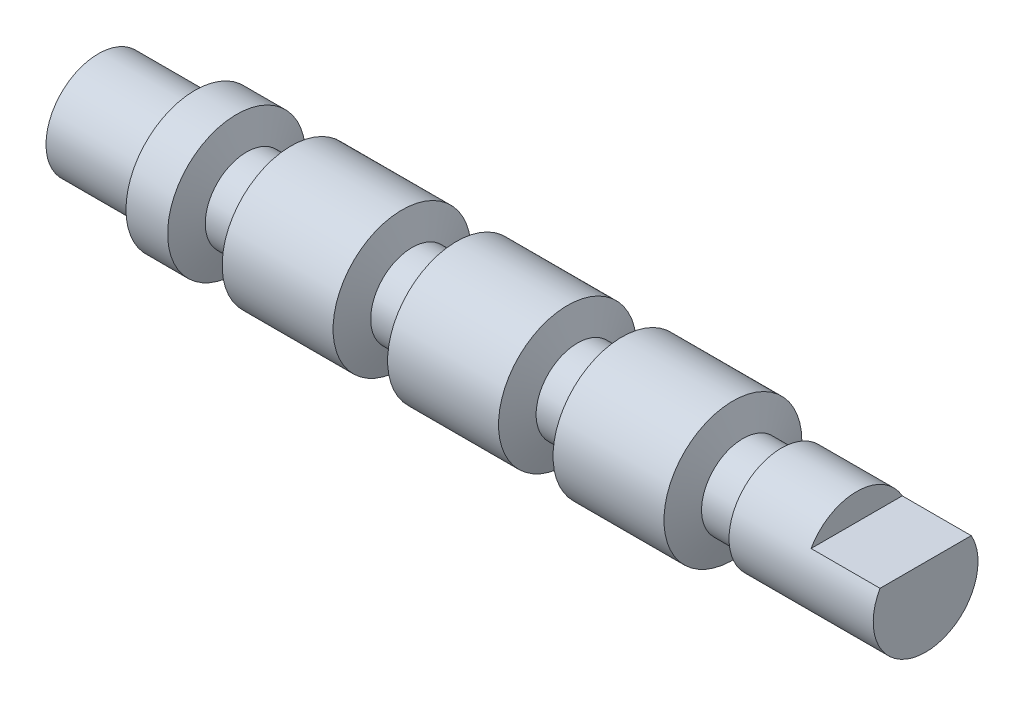
ISO-10303-21;
HEADER;
FILE_DESCRIPTION(('STEP AP214'),'2;1');
FILE_NAME('part.step','',(''),(''),'','','');
FILE_SCHEMA(('AUTOMOTIVE_DESIGN { 1 0 10303 214 1 1 1 1 }'));
ENDSEC;
DATA;
#1=APPLICATION_CONTEXT('core data for automotive mechanical design processes');
#2=APPLICATION_PROTOCOL_DEFINITION('international standard','automotive_design',2000,#1);
#3=PRODUCT_CONTEXT('',#1,'mechanical');
#4=PRODUCT('Part','Part','',(#3));
#5=PRODUCT_RELATED_PRODUCT_CATEGORY('part','',(#4));
#6=PRODUCT_DEFINITION_FORMATION('','',#4);
#7=PRODUCT_DEFINITION_CONTEXT('part definition',#1,'design');
#8=PRODUCT_DEFINITION('design','',#6,#7);
#9=PRODUCT_DEFINITION_SHAPE('','',#8);
#10=(LENGTH_UNIT() NAMED_UNIT(*) SI_UNIT(.MILLI.,.METRE.));
#11=(NAMED_UNIT(*) PLANE_ANGLE_UNIT() SI_UNIT($,.RADIAN.));
#12=(NAMED_UNIT(*) SI_UNIT($,.STERADIAN.) SOLID_ANGLE_UNIT());
#13=UNCERTAINTY_MEASURE_WITH_UNIT(LENGTH_MEASURE(1.E-05),#10,'distance_accuracy_value','');
#14=(GEOMETRIC_REPRESENTATION_CONTEXT(3) GLOBAL_UNCERTAINTY_ASSIGNED_CONTEXT((#13)) GLOBAL_UNIT_ASSIGNED_CONTEXT((#10,
#11,#12)) REPRESENTATION_CONTEXT('',''));
#15=CARTESIAN_POINT('',(0.,0.,0.));
#16=DIRECTION('',(0.,0.,1.));
#17=DIRECTION('',(1.,0.,0.));
#18=AXIS2_PLACEMENT_3D('',#15,#16,#17);
#19=CARTESIAN_POINT('',(19.9779404685324,0.,5.));
#20=DIRECTION('',(1.,0.,0.));
#21=DIRECTION('',(0.,0.,-1.));
#22=AXIS2_PLACEMENT_3D('',#19,#20,#21);
#23=CONICAL_SURFACE('',#22,5.,1.22173047639603);
#24=CARTESIAN_POINT('',(19.25,0.,5.));
#25=DIRECTION('',(1.,0.,0.));
#26=DIRECTION('',(0.,0.,-1.));
#27=AXIS2_PLACEMENT_3D('',#24,#25,#26);
#28=CIRCLE('',#27,3.);
#29=CARTESIAN_POINT('',(19.25,0.,2.));
#30=VERTEX_POINT('',#29);
#31=EDGE_CURVE('E108',#30,#30,#28,.T.);
#32=ORIENTED_EDGE('',*,*,#31,.T.);
#33=EDGE_LOOP('',(#32));
#34=FACE_BOUND('',#33,.T.);
#35=CARTESIAN_POINT('',(19.541176187413,0.,5.));
#36=DIRECTION('',(1.,0.,0.));
#37=DIRECTION('',(0.,0.,-1.));
#38=AXIS2_PLACEMENT_3D('',#35,#36,#37);
#39=CIRCLE('',#38,3.8);
#40=CARTESIAN_POINT('',(19.541176187413,0.,1.2));
#41=VERTEX_POINT('',#40);
#42=EDGE_CURVE('E89',#41,#41,#39,.F.);
#43=ORIENTED_EDGE('',*,*,#42,.T.);
#44=EDGE_LOOP('',(#43));
#45=FACE_BOUND('',#44,.T.);
#46=ADVANCED_FACE('F45',(#34,#45),#23,.T.);
#47=CARTESIAN_POINT('',(30.,0.,5.));
#48=DIRECTION('',(1.,0.,0.));
#49=DIRECTION('',(0.,0.,-1.));
#50=AXIS2_PLACEMENT_3D('',#47,#48,#49);
#51=CYLINDRICAL_SURFACE('',#50,5.);
#52=CARTESIAN_POINT('',(-19.9779404685324,0.,5.));
#53=DIRECTION('',(1.,0.,0.));
#54=DIRECTION('',(0.,0.,-1.));
#55=AXIS2_PLACEMENT_3D('',#52,#53,#54);
#56=CIRCLE('',#55,5.);
#57=CARTESIAN_POINT('',(-19.9779404685324,0.,0.));
#58=VERTEX_POINT('',#57);
#59=EDGE_CURVE('E11',#58,#58,#56,.T.);
#60=ORIENTED_EDGE('',*,*,#59,.F.);
#61=EDGE_LOOP('',(#60));
#62=FACE_BOUND('',#61,.T.);
#63=CARTESIAN_POINT('',(-23.,0.,5.));
#64=DIRECTION('',(-1.,0.,0.));
#65=DIRECTION('',(0.,0.,1.));
#66=AXIS2_PLACEMENT_3D('',#63,#64,#65);
#67=CIRCLE('',#66,5.00000000000017);
#68=CARTESIAN_POINT('',(-23.,0.,10.0000000000002));
#69=VERTEX_POINT('',#68);
#70=EDGE_CURVE('E101',#69,#69,#67,.T.);
#71=ORIENTED_EDGE('',*,*,#70,.F.);
#72=EDGE_LOOP('',(#71));
#73=FACE_BOUND('',#72,.T.);
#74=ADVANCED_FACE('F168',(#62,#73),#51,.T.);
#75=CARTESIAN_POINT('',(-19.25,0.,5.));
#76=DIRECTION('',(-1.,0.,0.));
#77=DIRECTION('',(0.,0.,1.));
#78=AXIS2_PLACEMENT_3D('',#75,#76,#77);
#79=CONICAL_SURFACE('',#78,3.,1.22173047639603);
#80=ORIENTED_EDGE('',*,*,#59,.T.);
#81=EDGE_LOOP('',(#80));
#82=FACE_BOUND('',#81,.T.);
#83=CARTESIAN_POINT('',(-19.25,0.,5.));
#84=DIRECTION('',(1.,0.,0.));
#85=DIRECTION('',(0.,0.,-1.));
#86=AXIS2_PLACEMENT_3D('',#83,#84,#85);
#87=CIRCLE('',#86,3.);
#88=CARTESIAN_POINT('',(-19.25,0.,2.));
#89=VERTEX_POINT('',#88);
#90=EDGE_CURVE('E54',#89,#89,#87,.T.);
#91=ORIENTED_EDGE('',*,*,#90,.F.);
#92=EDGE_LOOP('',(#91));
#93=FACE_BOUND('',#92,.T.);
#94=ADVANCED_FACE('F166',(#82,#93),#79,.T.);
#95=CARTESIAN_POINT('',(30.,0.,5.));
#96=DIRECTION('',(1.,0.,0.));
#97=DIRECTION('',(0.,0.,-1.));
#98=AXIS2_PLACEMENT_3D('',#95,#96,#97);
#99=CYLINDRICAL_SURFACE('',#98,3.);
#100=ORIENTED_EDGE('',*,*,#90,.T.);
#101=EDGE_LOOP('',(#100));
#102=FACE_BOUND('',#101,.T.);
#103=CARTESIAN_POINT('',(-16.75,0.,5.));
#104=DIRECTION('',(1.,0.,0.));
#105=DIRECTION('',(0.,0.,-1.));
#106=AXIS2_PLACEMENT_3D('',#103,#104,#105);
#107=CIRCLE('',#106,3.);
#108=CARTESIAN_POINT('',(-16.75,0.,2.));
#109=VERTEX_POINT('',#108);
#110=EDGE_CURVE('E156',#109,#109,#107,.T.);
#111=ORIENTED_EDGE('',*,*,#110,.F.);
#112=EDGE_LOOP('',(#111));
#113=FACE_BOUND('',#112,.T.);
#114=ADVANCED_FACE('F163',(#102,#113),#99,.T.);
#115=CARTESIAN_POINT('',(-16.0220595314676,0.,5.));
#116=DIRECTION('',(1.,0.,0.));
#117=DIRECTION('',(0.,0.,-1.));
#118=AXIS2_PLACEMENT_3D('',#115,#116,#117);
#119=CONICAL_SURFACE('',#118,5.,1.22173047639603);
#120=ORIENTED_EDGE('',*,*,#110,.T.);
#121=EDGE_LOOP('',(#120));
#122=FACE_BOUND('',#121,.T.);
#123=CARTESIAN_POINT('',(-16.0220595314676,0.,5.));
#124=DIRECTION('',(1.,0.,0.));
#125=DIRECTION('',(0.,0.,-1.));
#126=AXIS2_PLACEMENT_3D('',#123,#124,#125);
#127=CIRCLE('',#126,5.);
#128=CARTESIAN_POINT('',(-16.0220595314676,0.,0.));
#129=VERTEX_POINT('',#128);
#130=EDGE_CURVE('E152',#129,#129,#127,.T.);
#131=ORIENTED_EDGE('',*,*,#130,.F.);
#132=EDGE_LOOP('',(#131));
#133=FACE_BOUND('',#132,.T.);
#134=ADVANCED_FACE('F174',(#122,#133),#119,.T.);
#135=CARTESIAN_POINT('',(30.,0.,5.));
#136=DIRECTION('',(1.,0.,0.));
#137=DIRECTION('',(0.,0.,-1.));
#138=AXIS2_PLACEMENT_3D('',#135,#136,#137);
#139=CYLINDRICAL_SURFACE('',#138,5.);
#140=ORIENTED_EDGE('',*,*,#130,.T.);
#141=EDGE_LOOP('',(#140));
#142=FACE_BOUND('',#141,.T.);
#143=CARTESIAN_POINT('',(-7.9779404685324,0.,5.));
#144=DIRECTION('',(1.,0.,0.));
#145=DIRECTION('',(0.,0.,-1.));
#146=AXIS2_PLACEMENT_3D('',#143,#144,#145);
#147=CIRCLE('',#146,5.);
#148=CARTESIAN_POINT('',(-7.9779404685324,0.,0.));
#149=VERTEX_POINT('',#148);
#150=EDGE_CURVE('E148',#149,#149,#147,.T.);
#151=ORIENTED_EDGE('',*,*,#150,.F.);
#152=EDGE_LOOP('',(#151));
#153=FACE_BOUND('',#152,.T.);
#154=ADVANCED_FACE('F229',(#142,#153),#139,.T.);
#155=CARTESIAN_POINT('',(-7.25,0.,5.));
#156=DIRECTION('',(-1.,0.,0.));
#157=DIRECTION('',(0.,0.,1.));
#158=AXIS2_PLACEMENT_3D('',#155,#156,#157);
#159=CONICAL_SURFACE('',#158,3.,1.22173047639603);
#160=ORIENTED_EDGE('',*,*,#150,.T.);
#161=EDGE_LOOP('',(#160));
#162=FACE_BOUND('',#161,.T.);
#163=CARTESIAN_POINT('',(-7.25,0.,5.));
#164=DIRECTION('',(1.,0.,0.));
#165=DIRECTION('',(0.,0.,-1.));
#166=AXIS2_PLACEMENT_3D('',#163,#164,#165);
#167=CIRCLE('',#166,3.);
#168=CARTESIAN_POINT('',(-7.25,0.,2.));
#169=VERTEX_POINT('',#168);
#170=EDGE_CURVE('E144',#169,#169,#167,.T.);
#171=ORIENTED_EDGE('',*,*,#170,.F.);
#172=EDGE_LOOP('',(#171));
#173=FACE_BOUND('',#172,.T.);
#174=ADVANCED_FACE('F225',(#162,#173),#159,.T.);
#175=CARTESIAN_POINT('',(30.,0.,5.));
#176=DIRECTION('',(1.,0.,0.));
#177=DIRECTION('',(0.,0.,-1.));
#178=AXIS2_PLACEMENT_3D('',#175,#176,#177);
#179=CYLINDRICAL_SURFACE('',#178,3.);
#180=ORIENTED_EDGE('',*,*,#170,.T.);
#181=EDGE_LOOP('',(#180));
#182=FACE_BOUND('',#181,.T.);
#183=CARTESIAN_POINT('',(-4.75,0.,5.));
#184=DIRECTION('',(1.,0.,0.));
#185=DIRECTION('',(0.,0.,-1.));
#186=AXIS2_PLACEMENT_3D('',#183,#184,#185);
#187=CIRCLE('',#186,3.);
#188=CARTESIAN_POINT('',(-4.75,0.,2.));
#189=VERTEX_POINT('',#188);
#190=EDGE_CURVE('E140',#189,#189,#187,.T.);
#191=ORIENTED_EDGE('',*,*,#190,.F.);
#192=EDGE_LOOP('',(#191));
#193=FACE_BOUND('',#192,.T.);
#194=ADVANCED_FACE('F221',(#182,#193),#179,.T.);
#195=CARTESIAN_POINT('',(-4.0220595314676,0.,5.));
#196=DIRECTION('',(1.,0.,0.));
#197=DIRECTION('',(0.,0.,-1.));
#198=AXIS2_PLACEMENT_3D('',#195,#196,#197);
#199=CONICAL_SURFACE('',#198,5.,1.22173047639603);
#200=ORIENTED_EDGE('',*,*,#190,.T.);
#201=EDGE_LOOP('',(#200));
#202=FACE_BOUND('',#201,.T.);
#203=CARTESIAN_POINT('',(-4.0220595314676,0.,5.));
#204=DIRECTION('',(1.,0.,0.));
#205=DIRECTION('',(0.,0.,-1.));
#206=AXIS2_PLACEMENT_3D('',#203,#204,#205);
#207=CIRCLE('',#206,5.);
#208=CARTESIAN_POINT('',(-4.0220595314676,0.,0.));
#209=VERTEX_POINT('',#208);
#210=EDGE_CURVE('E136',#209,#209,#207,.T.);
#211=ORIENTED_EDGE('',*,*,#210,.F.);
#212=EDGE_LOOP('',(#211));
#213=FACE_BOUND('',#212,.T.);
#214=ADVANCED_FACE('F217',(#202,#213),#199,.T.);
#215=CARTESIAN_POINT('',(30.,0.,5.));
#216=DIRECTION('',(1.,0.,0.));
#217=DIRECTION('',(0.,0.,-1.));
#218=AXIS2_PLACEMENT_3D('',#215,#216,#217);
#219=CYLINDRICAL_SURFACE('',#218,5.);
#220=ORIENTED_EDGE('',*,*,#210,.T.);
#221=EDGE_LOOP('',(#220));
#222=FACE_BOUND('',#221,.T.);
#223=CARTESIAN_POINT('',(4.0220595314676,0.,5.));
#224=DIRECTION('',(1.,0.,0.));
#225=DIRECTION('',(0.,0.,-1.));
#226=AXIS2_PLACEMENT_3D('',#223,#224,#225);
#227=CIRCLE('',#226,5.);
#228=CARTESIAN_POINT('',(4.0220595314676,0.,0.));
#229=VERTEX_POINT('',#228);
#230=EDGE_CURVE('E132',#229,#229,#227,.T.);
#231=ORIENTED_EDGE('',*,*,#230,.F.);
#232=EDGE_LOOP('',(#231));
#233=FACE_BOUND('',#232,.T.);
#234=ADVANCED_FACE('F213',(#222,#233),#219,.T.);
#235=CARTESIAN_POINT('',(4.75,0.,5.));
#236=DIRECTION('',(-1.,0.,0.));
#237=DIRECTION('',(0.,0.,1.));
#238=AXIS2_PLACEMENT_3D('',#235,#236,#237);
#239=CONICAL_SURFACE('',#238,3.,1.22173047639603);
#240=ORIENTED_EDGE('',*,*,#230,.T.);
#241=EDGE_LOOP('',(#240));
#242=FACE_BOUND('',#241,.T.);
#243=CARTESIAN_POINT('',(4.75,0.,5.));
#244=DIRECTION('',(1.,0.,0.));
#245=DIRECTION('',(0.,0.,-1.));
#246=AXIS2_PLACEMENT_3D('',#243,#244,#245);
#247=CIRCLE('',#246,3.);
#248=CARTESIAN_POINT('',(4.75,0.,2.));
#249=VERTEX_POINT('',#248);
#250=EDGE_CURVE('E128',#249,#249,#247,.T.);
#251=ORIENTED_EDGE('',*,*,#250,.F.);
#252=EDGE_LOOP('',(#251));
#253=FACE_BOUND('',#252,.T.);
#254=ADVANCED_FACE('F209',(#242,#253),#239,.T.);
#255=CARTESIAN_POINT('',(30.,0.,5.));
#256=DIRECTION('',(1.,0.,0.));
#257=DIRECTION('',(0.,0.,-1.));
#258=AXIS2_PLACEMENT_3D('',#255,#256,#257);
#259=CYLINDRICAL_SURFACE('',#258,3.);
#260=ORIENTED_EDGE('',*,*,#250,.T.);
#261=EDGE_LOOP('',(#260));
#262=FACE_BOUND('',#261,.T.);
#263=CARTESIAN_POINT('',(7.25,0.,5.));
#264=DIRECTION('',(1.,0.,0.));
#265=DIRECTION('',(0.,0.,-1.));
#266=AXIS2_PLACEMENT_3D('',#263,#264,#265);
#267=CIRCLE('',#266,3.);
#268=CARTESIAN_POINT('',(7.25,0.,2.));
#269=VERTEX_POINT('',#268);
#270=EDGE_CURVE('E124',#269,#269,#267,.T.);
#271=ORIENTED_EDGE('',*,*,#270,.F.);
#272=EDGE_LOOP('',(#271));
#273=FACE_BOUND('',#272,.T.);
#274=ADVANCED_FACE('F205',(#262,#273),#259,.T.);
#275=CARTESIAN_POINT('',(7.9779404685324,0.,5.));
#276=DIRECTION('',(1.,0.,0.));
#277=DIRECTION('',(0.,0.,-1.));
#278=AXIS2_PLACEMENT_3D('',#275,#276,#277);
#279=CONICAL_SURFACE('',#278,5.,1.22173047639603);
#280=ORIENTED_EDGE('',*,*,#270,.T.);
#281=EDGE_LOOP('',(#280));
#282=FACE_BOUND('',#281,.T.);
#283=CARTESIAN_POINT('',(7.9779404685324,0.,5.));
#284=DIRECTION('',(1.,0.,0.));
#285=DIRECTION('',(0.,0.,-1.));
#286=AXIS2_PLACEMENT_3D('',#283,#284,#285);
#287=CIRCLE('',#286,5.);
#288=CARTESIAN_POINT('',(7.9779404685324,0.,0.));
#289=VERTEX_POINT('',#288);
#290=EDGE_CURVE('E120',#289,#289,#287,.T.);
#291=ORIENTED_EDGE('',*,*,#290,.F.);
#292=EDGE_LOOP('',(#291));
#293=FACE_BOUND('',#292,.T.);
#294=ADVANCED_FACE('F201',(#282,#293),#279,.T.);
#295=CARTESIAN_POINT('',(30.,0.,5.));
#296=DIRECTION('',(1.,0.,0.));
#297=DIRECTION('',(0.,0.,-1.));
#298=AXIS2_PLACEMENT_3D('',#295,#296,#297);
#299=CYLINDRICAL_SURFACE('',#298,5.);
#300=ORIENTED_EDGE('',*,*,#290,.T.);
#301=EDGE_LOOP('',(#300));
#302=FACE_BOUND('',#301,.T.);
#303=CARTESIAN_POINT('',(16.0220595314676,0.,5.));
#304=DIRECTION('',(1.,0.,0.));
#305=DIRECTION('',(0.,0.,-1.));
#306=AXIS2_PLACEMENT_3D('',#303,#304,#305);
#307=CIRCLE('',#306,5.);
#308=CARTESIAN_POINT('',(16.0220595314676,0.,0.));
#309=VERTEX_POINT('',#308);
#310=EDGE_CURVE('E116',#309,#309,#307,.T.);
#311=ORIENTED_EDGE('',*,*,#310,.F.);
#312=EDGE_LOOP('',(#311));
#313=FACE_BOUND('',#312,.T.);
#314=ADVANCED_FACE('F197',(#302,#313),#299,.T.);
#315=CARTESIAN_POINT('',(16.75,0.,5.));
#316=DIRECTION('',(-1.,0.,0.));
#317=DIRECTION('',(0.,0.,1.));
#318=AXIS2_PLACEMENT_3D('',#315,#316,#317);
#319=CONICAL_SURFACE('',#318,3.,1.22173047639603);
#320=ORIENTED_EDGE('',*,*,#310,.T.);
#321=EDGE_LOOP('',(#320));
#322=FACE_BOUND('',#321,.T.);
#323=CARTESIAN_POINT('',(16.75,0.,5.));
#324=DIRECTION('',(1.,0.,0.));
#325=DIRECTION('',(0.,0.,-1.));
#326=AXIS2_PLACEMENT_3D('',#323,#324,#325);
#327=CIRCLE('',#326,3.);
#328=CARTESIAN_POINT('',(16.75,0.,2.));
#329=VERTEX_POINT('',#328);
#330=EDGE_CURVE('E112',#329,#329,#327,.T.);
#331=ORIENTED_EDGE('',*,*,#330,.F.);
#332=EDGE_LOOP('',(#331));
#333=FACE_BOUND('',#332,.T.);
#334=ADVANCED_FACE('F193',(#322,#333),#319,.T.);
#335=CARTESIAN_POINT('',(30.,0.,5.));
#336=DIRECTION('',(1.,0.,0.));
#337=DIRECTION('',(0.,0.,-1.));
#338=AXIS2_PLACEMENT_3D('',#335,#336,#337);
#339=CYLINDRICAL_SURFACE('',#338,3.);
#340=ORIENTED_EDGE('',*,*,#330,.T.);
#341=EDGE_LOOP('',(#340));
#342=FACE_BOUND('',#341,.T.);
#343=ORIENTED_EDGE('',*,*,#31,.F.);
#344=EDGE_LOOP('',(#343));
#345=FACE_BOUND('',#344,.T.);
#346=ADVANCED_FACE('F189',(#342,#345),#339,.T.);
#347=CARTESIAN_POINT('',(-23.,0.,5.));
#348=DIRECTION('',(-1.,0.,0.));
#349=DIRECTION('',(0.,0.,1.));
#350=AXIS2_PLACEMENT_3D('',#347,#348,#349);
#351=PLANE('',#350);
#352=CARTESIAN_POINT('',(-23.,0.,5.));
#353=DIRECTION('',(-1.,0.,0.));
#354=DIRECTION('',(0.,0.,1.));
#355=AXIS2_PLACEMENT_3D('',#352,#353,#354);
#356=CIRCLE('',#355,3.8);
#357=CARTESIAN_POINT('',(-23.,0.,8.80000000000001));
#358=VERTEX_POINT('',#357);
#359=EDGE_CURVE('E97',#358,#358,#356,.T.);
#360=ORIENTED_EDGE('',*,*,#359,.F.);
#361=EDGE_LOOP('',(#360));
#362=FACE_BOUND('',#361,.T.);
#363=ORIENTED_EDGE('',*,*,#70,.T.);
#364=EDGE_LOOP('',(#363));
#365=FACE_BOUND('',#364,.T.);
#366=ADVANCED_FACE('F192',(#362,#365),#351,.T.);
#367=CARTESIAN_POINT('',(-23.,0.,5.));
#368=DIRECTION('',(-1.,0.,0.));
#369=DIRECTION('',(0.,0.,1.));
#370=AXIS2_PLACEMENT_3D('',#367,#368,#369);
#371=CYLINDRICAL_SURFACE('',#370,3.8);
#372=CARTESIAN_POINT('',(-30.,0.,5.00000000000001));
#373=DIRECTION('',(-1.,0.,0.));
#374=DIRECTION('',(0.,0.,1.));
#375=AXIS2_PLACEMENT_3D('',#372,#373,#374);
#376=CIRCLE('',#375,3.8);
#377=CARTESIAN_POINT('',(-30.,0.,8.80000000000001));
#378=VERTEX_POINT('',#377);
#379=EDGE_CURVE('E93',#378,#378,#376,.T.);
#380=CARTESIAN_POINT('',(-23.,0.,8.80000000000001));
#381=CARTESIAN_POINT('',(-23.0729166666667,0.,8.80000000000001));
#382=CARTESIAN_POINT('',(-23.1458333333333,0.,8.80000000000001));
#383=CARTESIAN_POINT('',(-23.2916666666667,0.,8.80000000000001));
#384=CARTESIAN_POINT('',(-23.3645833333333,0.,8.80000000000001));
#385=CARTESIAN_POINT('',(-23.5104166666667,0.,8.80000000000001));
#386=CARTESIAN_POINT('',(-23.5833333333333,0.,8.80000000000001));
#387=CARTESIAN_POINT('',(-23.7291666666667,0.,8.80000000000001));
#388=CARTESIAN_POINT('',(-23.8020833333333,0.,8.80000000000001));
#389=CARTESIAN_POINT('',(-23.9479166666667,0.,8.80000000000001));
#390=CARTESIAN_POINT('',(-24.0208333333333,0.,8.80000000000001));
#391=CARTESIAN_POINT('',(-24.1666666666667,0.,8.80000000000001));
#392=CARTESIAN_POINT('',(-24.2395833333333,0.,8.80000000000001));
#393=CARTESIAN_POINT('',(-24.3854166666667,0.,8.80000000000001));
#394=CARTESIAN_POINT('',(-24.4583333333333,0.,8.80000000000001));
#395=CARTESIAN_POINT('',(-24.6041666666667,0.,8.80000000000001));
#396=CARTESIAN_POINT('',(-24.6770833333333,0.,8.80000000000001));
#397=CARTESIAN_POINT('',(-24.8229166666667,0.,8.80000000000001));
#398=CARTESIAN_POINT('',(-24.8958333333333,0.,8.80000000000001));
#399=CARTESIAN_POINT('',(-25.0416666666667,0.,8.80000000000001));
#400=CARTESIAN_POINT('',(-25.1145833333333,0.,8.80000000000001));
#401=CARTESIAN_POINT('',(-25.2604166666667,0.,8.80000000000001));
#402=CARTESIAN_POINT('',(-25.3333333333333,0.,8.80000000000001));
#403=CARTESIAN_POINT('',(-25.4791666666667,0.,8.80000000000001));
#404=CARTESIAN_POINT('',(-25.5520833333333,0.,8.80000000000001));
#405=CARTESIAN_POINT('',(-25.6979166666667,0.,8.80000000000001));
#406=CARTESIAN_POINT('',(-25.7708333333333,0.,8.80000000000001));
#407=CARTESIAN_POINT('',(-25.9166666666667,0.,8.80000000000001));
#408=CARTESIAN_POINT('',(-25.9895833333333,0.,8.80000000000001));
#409=CARTESIAN_POINT('',(-26.1354166666667,0.,8.80000000000001));
#410=CARTESIAN_POINT('',(-26.2083333333333,0.,8.80000000000001));
#411=CARTESIAN_POINT('',(-26.3541666666667,0.,8.80000000000001));
#412=CARTESIAN_POINT('',(-26.4270833333333,0.,8.80000000000001));
#413=CARTESIAN_POINT('',(-26.5729166666667,0.,8.80000000000001));
#414=CARTESIAN_POINT('',(-26.6458333333333,0.,8.80000000000001));
#415=CARTESIAN_POINT('',(-26.7916666666667,0.,8.80000000000001));
#416=CARTESIAN_POINT('',(-26.8645833333333,0.,8.80000000000001));
#417=CARTESIAN_POINT('',(-27.0104166666667,0.,8.80000000000001));
#418=CARTESIAN_POINT('',(-27.0833333333333,0.,8.80000000000001));
#419=CARTESIAN_POINT('',(-27.2291666666667,0.,8.80000000000001));
#420=CARTESIAN_POINT('',(-27.3020833333333,0.,8.80000000000001));
#421=CARTESIAN_POINT('',(-27.4479166666667,0.,8.80000000000001));
#422=CARTESIAN_POINT('',(-27.5208333333333,0.,8.80000000000001));
#423=CARTESIAN_POINT('',(-27.6666666666667,0.,8.80000000000001));
#424=CARTESIAN_POINT('',(-27.7395833333333,0.,8.80000000000001));
#425=CARTESIAN_POINT('',(-27.8854166666667,0.,8.80000000000001));
#426=CARTESIAN_POINT('',(-27.9583333333333,0.,8.80000000000001));
#427=CARTESIAN_POINT('',(-28.1041666666667,0.,8.80000000000001));
#428=CARTESIAN_POINT('',(-28.1770833333333,0.,8.80000000000001));
#429=CARTESIAN_POINT('',(-28.3229166666667,0.,8.80000000000001));
#430=CARTESIAN_POINT('',(-28.3958333333333,0.,8.80000000000001));
#431=CARTESIAN_POINT('',(-28.5416666666667,0.,8.80000000000001));
#432=CARTESIAN_POINT('',(-28.6145833333333,0.,8.80000000000001));
#433=CARTESIAN_POINT('',(-28.7604166666667,0.,8.80000000000001));
#434=CARTESIAN_POINT('',(-28.8333333333333,0.,8.80000000000001));
#435=CARTESIAN_POINT('',(-28.9791666666667,0.,8.80000000000001));
#436=CARTESIAN_POINT('',(-29.0520833333333,0.,8.80000000000001));
#437=CARTESIAN_POINT('',(-29.1979166666667,0.,8.80000000000001));
#438=CARTESIAN_POINT('',(-29.2708333333333,0.,8.80000000000001));
#439=CARTESIAN_POINT('',(-29.4166666666667,0.,8.80000000000001));
#440=CARTESIAN_POINT('',(-29.4895833333333,0.,8.80000000000001));
#441=CARTESIAN_POINT('',(-29.6354166666667,0.,8.80000000000001));
#442=CARTESIAN_POINT('',(-29.7083333333333,0.,8.80000000000001));
#443=CARTESIAN_POINT('',(-29.8541666666667,0.,8.80000000000001));
#444=CARTESIAN_POINT('',(-29.9270833333333,0.,8.80000000000001));
#445=CARTESIAN_POINT('',(-30.,0.,8.80000000000001));
#446=B_SPLINE_CURVE_WITH_KNOTS('',3,(#380,#381,#382,#383,#384,#385,#386,#387,#388,#389,#390,
#391,#392,#393,#394,#395,#396,#397,#398,#399,#400,#401,#402,#403,#404,#405,#406,#407,#408,#409,
#410,#411,#412,#413,#414,#415,#416,#417,#418,#419,#420,#421,#422,#423,#424,#425,#426,#427,#428,
#429,#430,#431,#432,#433,#434,#435,#436,#437,#438,#439,#440,#441,#442,#443,#444,#445),
.UNSPECIFIED.,.F.,.F.,(4,2,2,2,2,2,2,2,2,2,2,2,2,2,2,2,2,2,2,2,2,2,2,2,2,2,2,2,2,2,2,2,4),(0.,
0.218749999999997,0.437499999999997,0.656249999999997,0.874999999999997,1.09375,1.3125,1.53125,
1.75,1.96875,2.1875,2.40625,2.625,2.84375,3.0625,3.28125,3.5,3.71875,3.9375,4.15625,4.375,
4.59375,4.8125,5.03125,5.25,5.46875,5.6875,5.90624999999999,6.125,6.34375,6.5625,6.78125,7.),.UNSPECIFIED.);
#447=EDGE_CURVE('BSEAM332',#358,#378,#446,.T.);
#448=ORIENTED_EDGE('',*,*,#359,.T.);
#449=ORIENTED_EDGE('',*,*,#379,.F.);
#450=ORIENTED_EDGE('',*,*,#447,.T.);
#451=ORIENTED_EDGE('',*,*,#447,.F.);
#452=EDGE_LOOP('',(#448,#450,#449,#451));
#453=FACE_BOUND('',#452,.T.);
#454=ADVANCED_FACE('F332',(#453),#371,.T.);
#455=CARTESIAN_POINT('',(-30.,0.,0.));
#456=DIRECTION('',(-1.,0.,0.));
#457=DIRECTION('',(0.,0.,1.));
#458=AXIS2_PLACEMENT_3D('',#455,#456,#457);
#459=PLANE('',#458);
#460=ORIENTED_EDGE('',*,*,#379,.T.);
#461=EDGE_LOOP('',(#460));
#462=FACE_BOUND('',#461,.T.);
#463=ADVANCED_FACE('F47',(#462),#459,.T.);
#464=CARTESIAN_POINT('',(18.,0.,5.));
#465=DIRECTION('',(1.,0.,0.));
#466=DIRECTION('',(0.,0.,-1.));
#467=AXIS2_PLACEMENT_3D('',#464,#465,#466);
#468=CYLINDRICAL_SURFACE('',#467,3.8);
#469=DIRECTION('',(1.,0.,0.));
#470=VECTOR('',#469,1.);
#471=CARTESIAN_POINT('',(25.,1.87085807792032,1.6924495389669));
#472=LINE('',#471,#470);
#473=CARTESIAN_POINT('',(25.,1.87085807792032,1.6924495389669));
#474=VERTEX_POINT('',#473);
#475=CARTESIAN_POINT('',(30.,1.87085807792032,1.6924495389669));
#476=VERTEX_POINT('',#475);
#477=EDGE_CURVE('E67',#474,#476,#472,.T.);
#478=ORIENTED_EDGE('',*,*,#477,.T.);
#479=CARTESIAN_POINT('',(30.,0.,4.99999999999999));
#480=DIRECTION('',(1.,0.,0.));
#481=DIRECTION('',(0.,0.,-1.));
#482=AXIS2_PLACEMENT_3D('',#479,#480,#481);
#483=CIRCLE('',#482,3.8);
#484=CARTESIAN_POINT('',(30.,1.87085807792032,8.3075504610331));
#485=VERTEX_POINT('',#484);
#486=EDGE_CURVE('E84',#485,#476,#483,.T.);
#487=ORIENTED_EDGE('',*,*,#486,.F.);
#488=DIRECTION('',(1.,0.,0.));
#489=VECTOR('',#488,1.);
#490=CARTESIAN_POINT('',(25.,1.87085807792032,8.3075504610331));
#491=LINE('',#490,#489);
#492=CARTESIAN_POINT('',(25.,1.87085807792032,8.3075504610331));
#493=VERTEX_POINT('',#492);
#494=EDGE_CURVE('E61',#493,#485,#491,.T.);
#495=ORIENTED_EDGE('',*,*,#494,.F.);
#496=CARTESIAN_POINT('',(25.,0.,5.));
#497=DIRECTION('',(1.,0.,0.));
#498=DIRECTION('',(0.,0.,-1.));
#499=AXIS2_PLACEMENT_3D('',#496,#497,#498);
#500=CIRCLE('',#499,3.8);
#501=EDGE_CURVE('E78',#474,#493,#500,.T.);
#502=ORIENTED_EDGE('',*,*,#501,.F.);
#503=EDGE_LOOP('',(#478,#487,#495,#502));
#504=FACE_BOUND('',#503,.T.);
#505=ORIENTED_EDGE('',*,*,#42,.F.);
#506=EDGE_LOOP('',(#505));
#507=FACE_BOUND('',#506,.T.);
#508=ADVANCED_FACE('F82',(#504,#507),#468,.T.);
#509=CARTESIAN_POINT('',(30.,0.,0.));
#510=DIRECTION('',(1.,0.,0.));
#511=DIRECTION('',(0.,0.,-1.));
#512=AXIS2_PLACEMENT_3D('',#509,#510,#511);
#513=PLANE('',#512);
#514=DIRECTION('',(0.,0.,-1.));
#515=VECTOR('',#514,1.);
#516=CARTESIAN_POINT('',(30.,1.87085807792032,8.3075504610331));
#517=LINE('',#516,#515);
#518=EDGE_CURVE('E72',#485,#476,#517,.T.);
#519=ORIENTED_EDGE('',*,*,#518,.F.);
#520=ORIENTED_EDGE('',*,*,#486,.T.);
#521=EDGE_LOOP('',(#519,#520));
#522=FACE_BOUND('',#521,.T.);
#523=ADVANCED_FACE('F87',(#522),#513,.T.);
#524=CARTESIAN_POINT('',(25.,1.87085807792032,8.3075504610331));
#525=DIRECTION('',(0.,-1.,0.));
#526=DIRECTION('',(0.,0.,-1.));
#527=AXIS2_PLACEMENT_3D('',#524,#525,#526);
#528=PLANE('',#527);
#529=ORIENTED_EDGE('',*,*,#518,.T.);
#530=ORIENTED_EDGE('',*,*,#477,.F.);
#531=DIRECTION('',(0.,0.,-1.));
#532=VECTOR('',#531,1.);
#533=CARTESIAN_POINT('',(25.,1.87085807792032,8.3075504610331));
#534=LINE('',#533,#532);
#535=EDGE_CURVE('E387',#493,#474,#534,.T.);
#536=ORIENTED_EDGE('',*,*,#535,.F.);
#537=ORIENTED_EDGE('',*,*,#494,.T.);
#538=EDGE_LOOP('',(#529,#530,#536,#537));
#539=FACE_BOUND('',#538,.T.);
#540=ADVANCED_FACE('F73',(#539),#528,.F.);
#541=CARTESIAN_POINT('',(25.,0.,5.));
#542=DIRECTION('',(1.,0.,0.));
#543=DIRECTION('',(0.,0.,-1.));
#544=AXIS2_PLACEMENT_3D('',#541,#542,#543);
#545=PLANE('',#544);
#546=ORIENTED_EDGE('',*,*,#501,.T.);
#547=ORIENTED_EDGE('',*,*,#535,.T.);
#548=EDGE_LOOP('',(#546,#547));
#549=FACE_BOUND('',#548,.T.);
#550=ADVANCED_FACE('F374',(#549),#545,.T.);
#551=CLOSED_SHELL('',(#46,#74,#94,#114,#134,#154,#174,#194,#214,#234,#254,#274,#294,#314,#334,
#346,#366,#454,#463,#508,#523,#540,#550));
#552=MANIFOLD_SOLID_BREP('B2',#551);
#553=ADVANCED_BREP_SHAPE_REPRESENTATION('',(#18,#552),#14);
#554=SHAPE_DEFINITION_REPRESENTATION(#9,#553);
ENDSEC;
END-ISO-10303-21;
